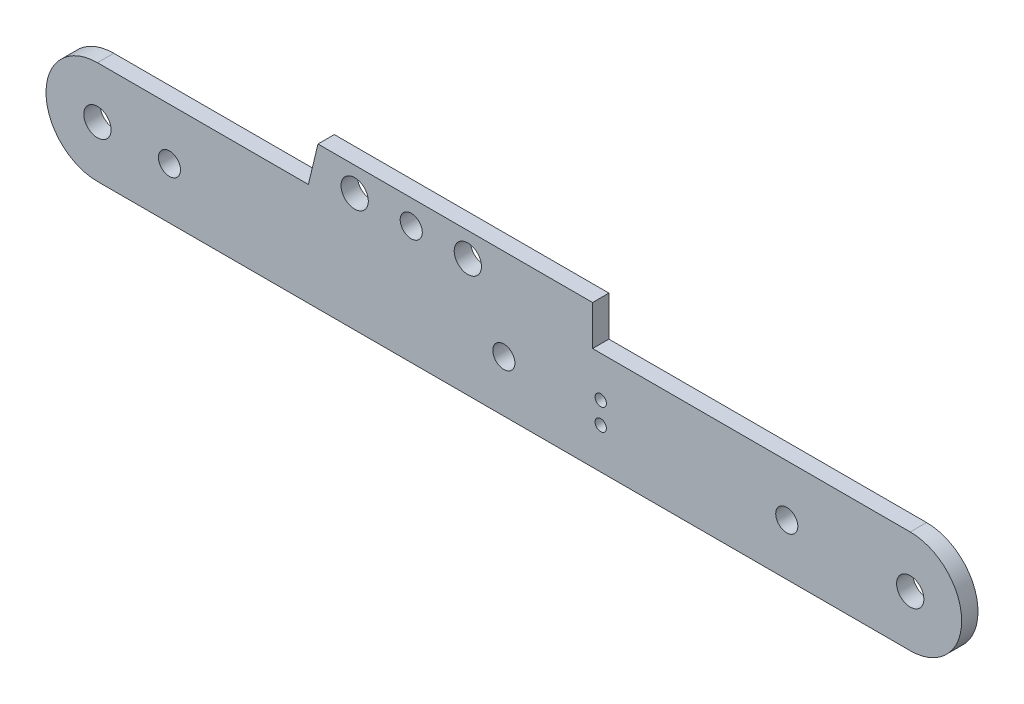
ISO-10303-21;
HEADER;
FILE_DESCRIPTION(('STEP AP214'),'2;1');
FILE_NAME('part.step','',(''),(''),'','','');
FILE_SCHEMA(('AUTOMOTIVE_DESIGN { 1 0 10303 214 1 1 1 1 }'));
ENDSEC;
DATA;
#1=APPLICATION_CONTEXT('core data for automotive mechanical design processes');
#2=APPLICATION_PROTOCOL_DEFINITION('international standard','automotive_design',2000,#1);
#3=PRODUCT_CONTEXT('',#1,'mechanical');
#4=PRODUCT('Part','Part','',(#3));
#5=PRODUCT_RELATED_PRODUCT_CATEGORY('part','',(#4));
#6=PRODUCT_DEFINITION_FORMATION('','',#4);
#7=PRODUCT_DEFINITION_CONTEXT('part definition',#1,'design');
#8=PRODUCT_DEFINITION('design','',#6,#7);
#9=PRODUCT_DEFINITION_SHAPE('','',#8);
#10=(LENGTH_UNIT() NAMED_UNIT(*) SI_UNIT(.MILLI.,.METRE.));
#11=(NAMED_UNIT(*) PLANE_ANGLE_UNIT() SI_UNIT($,.RADIAN.));
#12=(NAMED_UNIT(*) SI_UNIT($,.STERADIAN.) SOLID_ANGLE_UNIT());
#13=UNCERTAINTY_MEASURE_WITH_UNIT(LENGTH_MEASURE(1.E-05),#10,'distance_accuracy_value','');
#14=(GEOMETRIC_REPRESENTATION_CONTEXT(3) GLOBAL_UNCERTAINTY_ASSIGNED_CONTEXT((#13)) GLOBAL_UNIT_ASSIGNED_CONTEXT((#10,
#11,#12)) REPRESENTATION_CONTEXT('',''));
#15=CARTESIAN_POINT('',(0.,0.,0.));
#16=DIRECTION('',(0.,0.,1.));
#17=DIRECTION('',(1.,0.,0.));
#18=AXIS2_PLACEMENT_3D('',#15,#16,#17);
#19=CARTESIAN_POINT('',(-79.,10.,3.175));
#20=DIRECTION('',(0.,-1.,0.));
#21=DIRECTION('',(1.,0.,0.));
#22=AXIS2_PLACEMENT_3D('',#19,#20,#21);
#23=PLANE('',#22);
#24=DIRECTION('',(-1.,0.,0.));
#25=VECTOR('',#24,1.);
#26=CARTESIAN_POINT('',(-79.,10.,0.));
#27=LINE('',#26,#25);
#28=CARTESIAN_POINT('',(79.,10.,0.));
#29=VERTEX_POINT('',#28);
#30=CARTESIAN_POINT('',(17.25,10.,0.));
#31=VERTEX_POINT('',#30);
#32=EDGE_CURVE('E108',#29,#31,#27,.T.);
#33=ORIENTED_EDGE('',*,*,#32,.T.);
#34=DIRECTION('',(0.,0.,-1.));
#35=VECTOR('',#34,1.);
#36=CARTESIAN_POINT('',(17.25,10.,58.9659042765933));
#37=LINE('',#36,#35);
#38=CARTESIAN_POINT('',(17.25,10.,3.175));
#39=VERTEX_POINT('',#38);
#40=EDGE_CURVE('E56',#39,#31,#37,.T.);
#41=ORIENTED_EDGE('',*,*,#40,.F.);
#42=DIRECTION('',(-1.,0.,0.));
#43=VECTOR('',#42,1.);
#44=CARTESIAN_POINT('',(-79.,10.,3.175));
#45=LINE('',#44,#43);
#46=CARTESIAN_POINT('',(79.,10.,3.175));
#47=VERTEX_POINT('',#46);
#48=EDGE_CURVE('E158',#47,#39,#45,.T.);
#49=ORIENTED_EDGE('',*,*,#48,.F.);
#50=DIRECTION('',(0.,0.,-1.));
#51=VECTOR('',#50,1.);
#52=CARTESIAN_POINT('',(79.,10.,3.175));
#53=LINE('',#52,#51);
#54=EDGE_CURVE('E11',#47,#29,#53,.T.);
#55=ORIENTED_EDGE('',*,*,#54,.T.);
#56=EDGE_LOOP('',(#33,#41,#49,#55));
#57=FACE_BOUND('',#56,.T.);
#58=ADVANCED_FACE('F33',(#57),#23,.F.);
#59=CARTESIAN_POINT('',(79.,0.,3.175));
#60=DIRECTION('',(0.,0.,-1.));
#61=DIRECTION('',(-1.,0.,0.));
#62=AXIS2_PLACEMENT_3D('',#59,#60,#61);
#63=CYLINDRICAL_SURFACE('',#62,10.);
#64=CARTESIAN_POINT('',(79.,0.,0.));
#65=DIRECTION('',(0.,0.,1.));
#66=DIRECTION('',(-1.,0.,0.));
#67=AXIS2_PLACEMENT_3D('',#64,#65,#66);
#68=CIRCLE('',#67,10.);
#69=CARTESIAN_POINT('',(79.,-10.,0.));
#70=VERTEX_POINT('',#69);
#71=EDGE_CURVE('E109',#70,#29,#68,.T.);
#72=ORIENTED_EDGE('',*,*,#71,.T.);
#73=ORIENTED_EDGE('',*,*,#54,.F.);
#74=CARTESIAN_POINT('',(79.,0.,3.175));
#75=DIRECTION('',(0.,0.,1.));
#76=DIRECTION('',(-1.,0.,0.));
#77=AXIS2_PLACEMENT_3D('',#74,#75,#76);
#78=CIRCLE('',#77,10.);
#79=CARTESIAN_POINT('',(79.,-10.,3.175));
#80=VERTEX_POINT('',#79);
#81=EDGE_CURVE('E154',#80,#47,#78,.T.);
#82=ORIENTED_EDGE('',*,*,#81,.F.);
#83=DIRECTION('',(0.,0.,-1.));
#84=VECTOR('',#83,1.);
#85=CARTESIAN_POINT('',(79.,-10.,3.175));
#86=LINE('',#85,#84);
#87=EDGE_CURVE('E164',#80,#70,#86,.T.);
#88=ORIENTED_EDGE('',*,*,#87,.T.);
#89=EDGE_LOOP('',(#72,#73,#82,#88));
#90=FACE_BOUND('',#89,.T.);
#91=ADVANCED_FACE('F35',(#90),#63,.T.);
#92=CARTESIAN_POINT('',(-38.,10.,3.175));
#93=VERTEX_POINT('',#92);
#94=CARTESIAN_POINT('',(-79.,10.,3.175));
#95=VERTEX_POINT('',#94);
#96=EDGE_CURVE('E48',#93,#95,#45,.T.);
#97=ORIENTED_EDGE('',*,*,#96,.F.);
#98=DIRECTION('',(0.,0.,-1.));
#99=VECTOR('',#98,1.);
#100=CARTESIAN_POINT('',(-38.,10.,58.9659042765933));
#101=LINE('',#100,#99);
#102=CARTESIAN_POINT('',(-38.,10.,0.));
#103=VERTEX_POINT('',#102);
#104=EDGE_CURVE('E112',#93,#103,#101,.T.);
#105=ORIENTED_EDGE('',*,*,#104,.T.);
#106=CARTESIAN_POINT('',(-79.,10.,0.));
#107=VERTEX_POINT('',#106);
#108=EDGE_CURVE('E99',#103,#107,#27,.T.);
#109=ORIENTED_EDGE('',*,*,#108,.T.);
#110=DIRECTION('',(0.,0.,-1.));
#111=VECTOR('',#110,1.);
#112=CARTESIAN_POINT('',(-79.,10.,3.175));
#113=LINE('',#112,#111);
#114=EDGE_CURVE('E41',#95,#107,#113,.T.);
#115=ORIENTED_EDGE('',*,*,#114,.F.);
#116=EDGE_LOOP('',(#97,#105,#109,#115));
#117=FACE_BOUND('',#116,.T.);
#118=ADVANCED_FACE('F113',(#117),#23,.F.);
#119=CARTESIAN_POINT('',(-79.,0.,3.175));
#120=DIRECTION('',(0.,0.,-1.));
#121=DIRECTION('',(-1.,0.,0.));
#122=AXIS2_PLACEMENT_3D('',#119,#120,#121);
#123=CYLINDRICAL_SURFACE('',#122,10.);
#124=CARTESIAN_POINT('',(-79.,0.,0.));
#125=DIRECTION('',(0.,0.,1.));
#126=DIRECTION('',(-1.,0.,0.));
#127=AXIS2_PLACEMENT_3D('',#124,#125,#126);
#128=CIRCLE('',#127,10.);
#129=CARTESIAN_POINT('',(-79.,-10.,0.));
#130=VERTEX_POINT('',#129);
#131=EDGE_CURVE('E106',#107,#130,#128,.T.);
#132=ORIENTED_EDGE('',*,*,#131,.T.);
#133=DIRECTION('',(0.,0.,-1.));
#134=VECTOR('',#133,1.);
#135=CARTESIAN_POINT('',(-79.,-10.,3.175));
#136=LINE('',#135,#134);
#137=CARTESIAN_POINT('',(-79.,-10.,3.175));
#138=VERTEX_POINT('',#137);
#139=EDGE_CURVE('E171',#138,#130,#136,.T.);
#140=ORIENTED_EDGE('',*,*,#139,.F.);
#141=CARTESIAN_POINT('',(-79.,0.,3.175));
#142=DIRECTION('',(0.,0.,1.));
#143=DIRECTION('',(-1.,0.,0.));
#144=AXIS2_PLACEMENT_3D('',#141,#142,#143);
#145=CIRCLE('',#144,10.);
#146=EDGE_CURVE('E160',#95,#138,#145,.T.);
#147=ORIENTED_EDGE('',*,*,#146,.F.);
#148=ORIENTED_EDGE('',*,*,#114,.T.);
#149=EDGE_LOOP('',(#132,#140,#147,#148));
#150=FACE_BOUND('',#149,.T.);
#151=ADVANCED_FACE('F175',(#150),#123,.T.);
#152=CARTESIAN_POINT('',(-79.,-10.,3.175));
#153=DIRECTION('',(0.,1.,0.));
#154=DIRECTION('',(0.,0.,1.));
#155=AXIS2_PLACEMENT_3D('',#152,#153,#154);
#156=PLANE('',#155);
#157=DIRECTION('',(1.,0.,0.));
#158=VECTOR('',#157,1.);
#159=CARTESIAN_POINT('',(-79.,-10.,0.));
#160=LINE('',#159,#158);
#161=EDGE_CURVE('E157',#130,#70,#160,.T.);
#162=ORIENTED_EDGE('',*,*,#161,.T.);
#163=ORIENTED_EDGE('',*,*,#87,.F.);
#164=DIRECTION('',(1.,0.,0.));
#165=VECTOR('',#164,1.);
#166=CARTESIAN_POINT('',(-79.,-10.,3.175));
#167=LINE('',#166,#165);
#168=EDGE_CURVE('E162',#138,#80,#167,.T.);
#169=ORIENTED_EDGE('',*,*,#168,.F.);
#170=ORIENTED_EDGE('',*,*,#139,.T.);
#171=EDGE_LOOP('',(#162,#163,#169,#170));
#172=FACE_BOUND('',#171,.T.);
#173=ADVANCED_FACE('F211',(#172),#156,.F.);
#174=CARTESIAN_POINT('',(79.,0.,3.175));
#175=DIRECTION('',(0.,0.,-1.));
#176=DIRECTION('',(-1.,0.,0.));
#177=AXIS2_PLACEMENT_3D('',#174,#175,#176);
#178=PLANE('',#177);
#179=CARTESIAN_POINT('',(18.8375,2.1,3.175));
#180=DIRECTION('',(0.,0.,-1.));
#181=DIRECTION('',(-1.,0.,0.));
#182=AXIS2_PLACEMENT_3D('',#179,#180,#181);
#183=CIRCLE('',#182,1.1);
#184=CARTESIAN_POINT('',(17.7375,2.1,3.175));
#185=VERTEX_POINT('',#184);
#186=EDGE_CURVE('E270',#185,#185,#183,.T.);
#187=ORIENTED_EDGE('',*,*,#186,.T.);
#188=EDGE_LOOP('',(#187));
#189=FACE_BOUND('',#188,.T.);
#190=CARTESIAN_POINT('',(18.8375,-2.1,3.175));
#191=DIRECTION('',(0.,0.,-1.));
#192=DIRECTION('',(-1.,0.,0.));
#193=AXIS2_PLACEMENT_3D('',#190,#191,#192);
#194=CIRCLE('',#193,1.1);
#195=CARTESIAN_POINT('',(17.7375,-2.1,3.175));
#196=VERTEX_POINT('',#195);
#197=EDGE_CURVE('E280',#196,#196,#194,.T.);
#198=ORIENTED_EDGE('',*,*,#197,.T.);
#199=EDGE_LOOP('',(#198));
#200=FACE_BOUND('',#199,.T.);
#201=CARTESIAN_POINT('',(55.,0.,3.175));
#202=DIRECTION('',(0.,0.,-1.));
#203=DIRECTION('',(-1.,0.,0.));
#204=AXIS2_PLACEMENT_3D('',#201,#202,#203);
#205=CIRCLE('',#204,2.15);
#206=CARTESIAN_POINT('',(52.85,0.,3.175));
#207=VERTEX_POINT('',#206);
#208=EDGE_CURVE('E286',#207,#207,#205,.T.);
#209=ORIENTED_EDGE('',*,*,#208,.T.);
#210=EDGE_LOOP('',(#209));
#211=FACE_BOUND('',#210,.T.);
#212=CARTESIAN_POINT('',(-18.,13.,3.175));
#213=DIRECTION('',(0.,0.,-1.));
#214=DIRECTION('',(-1.,0.,0.));
#215=AXIS2_PLACEMENT_3D('',#212,#213,#214);
#216=CIRCLE('',#215,2.15);
#217=CARTESIAN_POINT('',(-20.15,13.,3.175));
#218=VERTEX_POINT('',#217);
#219=EDGE_CURVE('E292',#218,#218,#216,.T.);
#220=ORIENTED_EDGE('',*,*,#219,.T.);
#221=EDGE_LOOP('',(#220));
#222=FACE_BOUND('',#221,.T.);
#223=CARTESIAN_POINT('',(-65.,0.,3.175));
#224=DIRECTION('',(0.,0.,-1.));
#225=DIRECTION('',(-1.,0.,0.));
#226=AXIS2_PLACEMENT_3D('',#223,#224,#225);
#227=CIRCLE('',#226,2.15);
#228=CARTESIAN_POINT('',(-67.15,0.,3.175));
#229=VERTEX_POINT('',#228);
#230=EDGE_CURVE('E298',#229,#229,#227,.T.);
#231=ORIENTED_EDGE('',*,*,#230,.T.);
#232=EDGE_LOOP('',(#231));
#233=FACE_BOUND('',#232,.T.);
#234=CARTESIAN_POINT('',(0.,0.,3.175));
#235=DIRECTION('',(0.,0.,-1.));
#236=DIRECTION('',(-1.,0.,0.));
#237=AXIS2_PLACEMENT_3D('',#234,#235,#236);
#238=CIRCLE('',#237,2.15);
#239=CARTESIAN_POINT('',(-2.15,0.,3.175));
#240=VERTEX_POINT('',#239);
#241=EDGE_CURVE('E304',#240,#240,#238,.T.);
#242=ORIENTED_EDGE('',*,*,#241,.T.);
#243=EDGE_LOOP('',(#242));
#244=FACE_BOUND('',#243,.T.);
#245=CARTESIAN_POINT('',(-7.,13.,3.175));
#246=DIRECTION('',(0.,0.,-1.));
#247=DIRECTION('',(-1.,0.,0.));
#248=AXIS2_PLACEMENT_3D('',#245,#246,#247);
#249=CIRCLE('',#248,2.65);
#250=CARTESIAN_POINT('',(-9.65,13.,3.175));
#251=VERTEX_POINT('',#250);
#252=EDGE_CURVE('E310',#251,#251,#249,.T.);
#253=ORIENTED_EDGE('',*,*,#252,.T.);
#254=EDGE_LOOP('',(#253));
#255=FACE_BOUND('',#254,.T.);
#256=CARTESIAN_POINT('',(-29.,13.,3.175));
#257=DIRECTION('',(0.,0.,-1.));
#258=DIRECTION('',(-1.,0.,0.));
#259=AXIS2_PLACEMENT_3D('',#256,#257,#258);
#260=CIRCLE('',#259,2.65);
#261=CARTESIAN_POINT('',(-31.65,13.,3.175));
#262=VERTEX_POINT('',#261);
#263=EDGE_CURVE('E123',#262,#262,#260,.T.);
#264=ORIENTED_EDGE('',*,*,#263,.T.);
#265=EDGE_LOOP('',(#264));
#266=FACE_BOUND('',#265,.T.);
#267=CARTESIAN_POINT('',(79.,0.,3.175));
#268=DIRECTION('',(0.,0.,-1.));
#269=DIRECTION('',(-1.,0.,0.));
#270=AXIS2_PLACEMENT_3D('',#267,#268,#269);
#271=CIRCLE('',#270,2.65);
#272=CARTESIAN_POINT('',(76.35,0.,3.175));
#273=VERTEX_POINT('',#272);
#274=EDGE_CURVE('E145',#273,#273,#271,.T.);
#275=ORIENTED_EDGE('',*,*,#274,.T.);
#276=EDGE_LOOP('',(#275));
#277=FACE_BOUND('',#276,.T.);
#278=CARTESIAN_POINT('',(-79.,0.,3.175));
#279=DIRECTION('',(0.,0.,-1.));
#280=DIRECTION('',(-1.,0.,0.));
#281=AXIS2_PLACEMENT_3D('',#278,#279,#280);
#282=CIRCLE('',#281,2.65);
#283=CARTESIAN_POINT('',(-81.65,0.,3.175));
#284=VERTEX_POINT('',#283);
#285=EDGE_CURVE('E151',#284,#284,#282,.T.);
#286=ORIENTED_EDGE('',*,*,#285,.T.);
#287=EDGE_LOOP('',(#286));
#288=FACE_BOUND('',#287,.T.);
#289=ORIENTED_EDGE('',*,*,#81,.T.);
#290=ORIENTED_EDGE('',*,*,#48,.T.);
#291=DIRECTION('',(0.,1.,0.));
#292=VECTOR('',#291,1.);
#293=CARTESIAN_POINT('',(17.25,17.75,3.175));
#294=LINE('',#293,#292);
#295=CARTESIAN_POINT('',(17.25,17.75,3.175));
#296=VERTEX_POINT('',#295);
#297=EDGE_CURVE('E130',#39,#296,#294,.T.);
#298=ORIENTED_EDGE('',*,*,#297,.T.);
#299=DIRECTION('',(-1.,0.,0.));
#300=VECTOR('',#299,1.);
#301=CARTESIAN_POINT('',(-36.1293103448276,17.75,3.175));
#302=LINE('',#301,#300);
#303=CARTESIAN_POINT('',(-36.1293103448276,17.75,3.175));
#304=VERTEX_POINT('',#303);
#305=EDGE_CURVE('E136',#296,#304,#302,.T.);
#306=ORIENTED_EDGE('',*,*,#305,.T.);
#307=DIRECTION('',(-0.234640533103897,-0.972082208573287,0.));
#308=VECTOR('',#307,1.);
#309=CARTESIAN_POINT('',(-38.,10.,3.175));
#310=LINE('',#309,#308);
#311=EDGE_CURVE('E140',#304,#93,#310,.T.);
#312=ORIENTED_EDGE('',*,*,#311,.T.);
#313=ORIENTED_EDGE('',*,*,#96,.T.);
#314=ORIENTED_EDGE('',*,*,#146,.T.);
#315=ORIENTED_EDGE('',*,*,#168,.T.);
#316=EDGE_LOOP('',(#289,#290,#298,#306,#312,#313,#314,#315));
#317=FACE_BOUND('',#316,.T.);
#318=ADVANCED_FACE('F179',(#189,#200,#211,#222,#233,#244,#255,#266,#277,#288,#317),#178,.F.);
#319=CARTESIAN_POINT('',(79.,0.,0.));
#320=DIRECTION('',(0.,0.,-1.));
#321=DIRECTION('',(-1.,0.,0.));
#322=AXIS2_PLACEMENT_3D('',#319,#320,#321);
#323=PLANE('',#322);
#324=CARTESIAN_POINT('',(18.8375,2.1,0.));
#325=DIRECTION('',(0.,0.,-1.));
#326=DIRECTION('',(-1.,0.,0.));
#327=AXIS2_PLACEMENT_3D('',#324,#325,#326);
#328=CIRCLE('',#327,1.1);
#329=CARTESIAN_POINT('',(17.7375,2.1,0.));
#330=VERTEX_POINT('',#329);
#331=EDGE_CURVE('E273',#330,#330,#328,.T.);
#332=ORIENTED_EDGE('',*,*,#331,.F.);
#333=EDGE_LOOP('',(#332));
#334=FACE_BOUND('',#333,.T.);
#335=CARTESIAN_POINT('',(18.8375,-2.1,0.));
#336=DIRECTION('',(0.,0.,-1.));
#337=DIRECTION('',(-1.,0.,0.));
#338=AXIS2_PLACEMENT_3D('',#335,#336,#337);
#339=CIRCLE('',#338,1.1);
#340=CARTESIAN_POINT('',(17.7375,-2.1,0.));
#341=VERTEX_POINT('',#340);
#342=EDGE_CURVE('E275',#341,#341,#339,.T.);
#343=ORIENTED_EDGE('',*,*,#342,.F.);
#344=EDGE_LOOP('',(#343));
#345=FACE_BOUND('',#344,.T.);
#346=CARTESIAN_POINT('',(55.,0.,0.));
#347=DIRECTION('',(0.,0.,-1.));
#348=DIRECTION('',(-1.,0.,0.));
#349=AXIS2_PLACEMENT_3D('',#346,#347,#348);
#350=CIRCLE('',#349,2.15);
#351=CARTESIAN_POINT('',(52.85,0.,0.));
#352=VERTEX_POINT('',#351);
#353=EDGE_CURVE('E283',#352,#352,#350,.T.);
#354=ORIENTED_EDGE('',*,*,#353,.F.);
#355=EDGE_LOOP('',(#354));
#356=FACE_BOUND('',#355,.T.);
#357=CARTESIAN_POINT('',(-18.,13.,0.));
#358=DIRECTION('',(0.,0.,-1.));
#359=DIRECTION('',(-1.,0.,0.));
#360=AXIS2_PLACEMENT_3D('',#357,#358,#359);
#361=CIRCLE('',#360,2.15);
#362=CARTESIAN_POINT('',(-20.15,13.,0.));
#363=VERTEX_POINT('',#362);
#364=EDGE_CURVE('E289',#363,#363,#361,.T.);
#365=ORIENTED_EDGE('',*,*,#364,.F.);
#366=EDGE_LOOP('',(#365));
#367=FACE_BOUND('',#366,.T.);
#368=CARTESIAN_POINT('',(-65.,0.,0.));
#369=DIRECTION('',(0.,0.,-1.));
#370=DIRECTION('',(-1.,0.,0.));
#371=AXIS2_PLACEMENT_3D('',#368,#369,#370);
#372=CIRCLE('',#371,2.15);
#373=CARTESIAN_POINT('',(-67.15,0.,0.));
#374=VERTEX_POINT('',#373);
#375=EDGE_CURVE('E295',#374,#374,#372,.T.);
#376=ORIENTED_EDGE('',*,*,#375,.F.);
#377=EDGE_LOOP('',(#376));
#378=FACE_BOUND('',#377,.T.);
#379=CARTESIAN_POINT('',(0.,0.,0.));
#380=DIRECTION('',(0.,0.,-1.));
#381=DIRECTION('',(-1.,0.,0.));
#382=AXIS2_PLACEMENT_3D('',#379,#380,#381);
#383=CIRCLE('',#382,2.15);
#384=CARTESIAN_POINT('',(-2.15,0.,0.));
#385=VERTEX_POINT('',#384);
#386=EDGE_CURVE('E301',#385,#385,#383,.T.);
#387=ORIENTED_EDGE('',*,*,#386,.F.);
#388=EDGE_LOOP('',(#387));
#389=FACE_BOUND('',#388,.T.);
#390=CARTESIAN_POINT('',(-7.,13.,0.));
#391=DIRECTION('',(0.,0.,-1.));
#392=DIRECTION('',(-1.,0.,0.));
#393=AXIS2_PLACEMENT_3D('',#390,#391,#392);
#394=CIRCLE('',#393,2.65);
#395=CARTESIAN_POINT('',(-9.65,13.,0.));
#396=VERTEX_POINT('',#395);
#397=EDGE_CURVE('E307',#396,#396,#394,.T.);
#398=ORIENTED_EDGE('',*,*,#397,.F.);
#399=EDGE_LOOP('',(#398));
#400=FACE_BOUND('',#399,.T.);
#401=CARTESIAN_POINT('',(-29.,13.,0.));
#402=DIRECTION('',(0.,0.,-1.));
#403=DIRECTION('',(-1.,0.,0.));
#404=AXIS2_PLACEMENT_3D('',#401,#402,#403);
#405=CIRCLE('',#404,2.65);
#406=CARTESIAN_POINT('',(-31.65,13.,0.));
#407=VERTEX_POINT('',#406);
#408=EDGE_CURVE('E127',#407,#407,#405,.T.);
#409=ORIENTED_EDGE('',*,*,#408,.F.);
#410=EDGE_LOOP('',(#409));
#411=FACE_BOUND('',#410,.T.);
#412=CARTESIAN_POINT('',(79.,0.,0.));
#413=DIRECTION('',(0.,0.,-1.));
#414=DIRECTION('',(-1.,0.,0.));
#415=AXIS2_PLACEMENT_3D('',#412,#413,#414);
#416=CIRCLE('',#415,2.65);
#417=CARTESIAN_POINT('',(76.35,0.,0.));
#418=VERTEX_POINT('',#417);
#419=EDGE_CURVE('E142',#418,#418,#416,.T.);
#420=ORIENTED_EDGE('',*,*,#419,.F.);
#421=EDGE_LOOP('',(#420));
#422=FACE_BOUND('',#421,.T.);
#423=CARTESIAN_POINT('',(-79.,0.,0.));
#424=DIRECTION('',(0.,0.,-1.));
#425=DIRECTION('',(-1.,0.,0.));
#426=AXIS2_PLACEMENT_3D('',#423,#424,#425);
#427=CIRCLE('',#426,2.65);
#428=CARTESIAN_POINT('',(-81.65,0.,0.));
#429=VERTEX_POINT('',#428);
#430=EDGE_CURVE('E148',#429,#429,#427,.T.);
#431=ORIENTED_EDGE('',*,*,#430,.F.);
#432=EDGE_LOOP('',(#431));
#433=FACE_BOUND('',#432,.T.);
#434=ORIENTED_EDGE('',*,*,#71,.F.);
#435=ORIENTED_EDGE('',*,*,#161,.F.);
#436=ORIENTED_EDGE('',*,*,#131,.F.);
#437=ORIENTED_EDGE('',*,*,#108,.F.);
#438=DIRECTION('',(0.234640533103897,0.972082208573287,0.));
#439=VECTOR('',#438,1.);
#440=CARTESIAN_POINT('',(-38.,10.,0.));
#441=LINE('',#440,#439);
#442=CARTESIAN_POINT('',(-36.1293103448276,17.75,0.));
#443=VERTEX_POINT('',#442);
#444=EDGE_CURVE('E104',#103,#443,#441,.T.);
#445=ORIENTED_EDGE('',*,*,#444,.T.);
#446=DIRECTION('',(1.,0.,0.));
#447=VECTOR('',#446,1.);
#448=CARTESIAN_POINT('',(-36.1293103448276,17.75,0.));
#449=LINE('',#448,#447);
#450=CARTESIAN_POINT('',(17.25,17.75,0.));
#451=VERTEX_POINT('',#450);
#452=EDGE_CURVE('E122',#443,#451,#449,.T.);
#453=ORIENTED_EDGE('',*,*,#452,.T.);
#454=DIRECTION('',(0.,-1.,0.));
#455=VECTOR('',#454,1.);
#456=CARTESIAN_POINT('',(17.25,17.75,0.));
#457=LINE('',#456,#455);
#458=EDGE_CURVE('E117',#451,#31,#457,.T.);
#459=ORIENTED_EDGE('',*,*,#458,.T.);
#460=ORIENTED_EDGE('',*,*,#32,.F.);
#461=EDGE_LOOP('',(#434,#435,#436,#437,#445,#453,#459,#460));
#462=FACE_BOUND('',#461,.T.);
#463=ADVANCED_FACE('F101',(#334,#345,#356,#367,#378,#389,#400,#411,#422,#433,#462),#323,.T.);
#464=CARTESIAN_POINT('',(-79.,0.,0.));
#465=DIRECTION('',(0.,0.,-1.));
#466=DIRECTION('',(-1.,0.,0.));
#467=AXIS2_PLACEMENT_3D('',#464,#465,#466);
#468=CYLINDRICAL_SURFACE('',#467,2.65);
#469=ORIENTED_EDGE('',*,*,#285,.F.);
#470=EDGE_LOOP('',(#469));
#471=FACE_BOUND('',#470,.T.);
#472=ORIENTED_EDGE('',*,*,#430,.T.);
#473=EDGE_LOOP('',(#472));
#474=FACE_BOUND('',#473,.T.);
#475=ADVANCED_FACE('F197',(#471,#474),#468,.F.);
#476=CARTESIAN_POINT('',(79.,0.,0.));
#477=DIRECTION('',(0.,0.,-1.));
#478=DIRECTION('',(-1.,0.,0.));
#479=AXIS2_PLACEMENT_3D('',#476,#477,#478);
#480=CYLINDRICAL_SURFACE('',#479,2.65);
#481=ORIENTED_EDGE('',*,*,#274,.F.);
#482=EDGE_LOOP('',(#481));
#483=FACE_BOUND('',#482,.T.);
#484=ORIENTED_EDGE('',*,*,#419,.T.);
#485=EDGE_LOOP('',(#484));
#486=FACE_BOUND('',#485,.T.);
#487=ADVANCED_FACE('F190',(#483,#486),#480,.F.);
#488=CARTESIAN_POINT('',(17.25,17.75,58.9659042765933));
#489=DIRECTION('',(1.,0.,0.));
#490=DIRECTION('',(0.,1.,0.));
#491=AXIS2_PLACEMENT_3D('',#488,#489,#490);
#492=PLANE('',#491);
#493=ORIENTED_EDGE('',*,*,#297,.F.);
#494=ORIENTED_EDGE('',*,*,#40,.T.);
#495=ORIENTED_EDGE('',*,*,#458,.F.);
#496=DIRECTION('',(0.,0.,-1.));
#497=VECTOR('',#496,1.);
#498=CARTESIAN_POINT('',(17.25,17.75,58.9659042765933));
#499=LINE('',#498,#497);
#500=EDGE_CURVE('E137',#296,#451,#499,.T.);
#501=ORIENTED_EDGE('',*,*,#500,.F.);
#502=EDGE_LOOP('',(#493,#494,#495,#501));
#503=FACE_BOUND('',#502,.T.);
#504=ADVANCED_FACE('F188',(#503),#492,.T.);
#505=CARTESIAN_POINT('',(-36.1293103448276,17.75,58.9659042765933));
#506=DIRECTION('',(0.,1.,0.));
#507=DIRECTION('',(-1.,0.,0.));
#508=AXIS2_PLACEMENT_3D('',#505,#506,#507);
#509=PLANE('',#508);
#510=ORIENTED_EDGE('',*,*,#305,.F.);
#511=ORIENTED_EDGE('',*,*,#500,.T.);
#512=ORIENTED_EDGE('',*,*,#452,.F.);
#513=DIRECTION('',(0.,0.,-1.));
#514=VECTOR('',#513,1.);
#515=CARTESIAN_POINT('',(-36.1293103448276,17.75,58.9659042765933));
#516=LINE('',#515,#514);
#517=EDGE_CURVE('E116',#304,#443,#516,.T.);
#518=ORIENTED_EDGE('',*,*,#517,.F.);
#519=EDGE_LOOP('',(#510,#511,#512,#518));
#520=FACE_BOUND('',#519,.T.);
#521=ADVANCED_FACE('F185',(#520),#509,.T.);
#522=CARTESIAN_POINT('',(-38.,10.,58.9659042765933));
#523=DIRECTION('',(-0.972082208573287,0.234640533103897,0.));
#524=DIRECTION('',(-0.234640533103897,-0.972082208573287,0.));
#525=AXIS2_PLACEMENT_3D('',#522,#523,#524);
#526=PLANE('',#525);
#527=ORIENTED_EDGE('',*,*,#311,.F.);
#528=ORIENTED_EDGE('',*,*,#517,.T.);
#529=ORIENTED_EDGE('',*,*,#444,.F.);
#530=ORIENTED_EDGE('',*,*,#104,.F.);
#531=EDGE_LOOP('',(#527,#528,#529,#530));
#532=FACE_BOUND('',#531,.T.);
#533=ADVANCED_FACE('F119',(#532),#526,.T.);
#534=CARTESIAN_POINT('',(-29.,13.,0.));
#535=DIRECTION('',(0.,0.,-1.));
#536=DIRECTION('',(-1.,0.,0.));
#537=AXIS2_PLACEMENT_3D('',#534,#535,#536);
#538=CYLINDRICAL_SURFACE('',#537,2.65);
#539=ORIENTED_EDGE('',*,*,#263,.F.);
#540=EDGE_LOOP('',(#539));
#541=FACE_BOUND('',#540,.T.);
#542=ORIENTED_EDGE('',*,*,#408,.T.);
#543=EDGE_LOOP('',(#542));
#544=FACE_BOUND('',#543,.T.);
#545=ADVANCED_FACE('F228',(#541,#544),#538,.F.);
#546=CARTESIAN_POINT('',(-7.,13.,0.));
#547=DIRECTION('',(0.,0.,-1.));
#548=DIRECTION('',(-1.,0.,0.));
#549=AXIS2_PLACEMENT_3D('',#546,#547,#548);
#550=CYLINDRICAL_SURFACE('',#549,2.65);
#551=ORIENTED_EDGE('',*,*,#252,.F.);
#552=EDGE_LOOP('',(#551));
#553=FACE_BOUND('',#552,.T.);
#554=ORIENTED_EDGE('',*,*,#397,.T.);
#555=EDGE_LOOP('',(#554));
#556=FACE_BOUND('',#555,.T.);
#557=ADVANCED_FACE('F232',(#553,#556),#550,.F.);
#558=CARTESIAN_POINT('',(0.,0.,0.));
#559=DIRECTION('',(0.,0.,-1.));
#560=DIRECTION('',(-1.,0.,0.));
#561=AXIS2_PLACEMENT_3D('',#558,#559,#560);
#562=CYLINDRICAL_SURFACE('',#561,2.15);
#563=ORIENTED_EDGE('',*,*,#241,.F.);
#564=EDGE_LOOP('',(#563));
#565=FACE_BOUND('',#564,.T.);
#566=ORIENTED_EDGE('',*,*,#386,.T.);
#567=EDGE_LOOP('',(#566));
#568=FACE_BOUND('',#567,.T.);
#569=ADVANCED_FACE('F237',(#565,#568),#562,.F.);
#570=CARTESIAN_POINT('',(-65.,0.,0.));
#571=DIRECTION('',(0.,0.,-1.));
#572=DIRECTION('',(-1.,0.,0.));
#573=AXIS2_PLACEMENT_3D('',#570,#571,#572);
#574=CYLINDRICAL_SURFACE('',#573,2.15);
#575=ORIENTED_EDGE('',*,*,#230,.F.);
#576=EDGE_LOOP('',(#575));
#577=FACE_BOUND('',#576,.T.);
#578=ORIENTED_EDGE('',*,*,#375,.T.);
#579=EDGE_LOOP('',(#578));
#580=FACE_BOUND('',#579,.T.);
#581=ADVANCED_FACE('F245',(#577,#580),#574,.F.);
#582=CARTESIAN_POINT('',(-18.,13.,0.));
#583=DIRECTION('',(0.,0.,-1.));
#584=DIRECTION('',(-1.,0.,0.));
#585=AXIS2_PLACEMENT_3D('',#582,#583,#584);
#586=CYLINDRICAL_SURFACE('',#585,2.15);
#587=ORIENTED_EDGE('',*,*,#219,.F.);
#588=EDGE_LOOP('',(#587));
#589=FACE_BOUND('',#588,.T.);
#590=ORIENTED_EDGE('',*,*,#364,.T.);
#591=EDGE_LOOP('',(#590));
#592=FACE_BOUND('',#591,.T.);
#593=ADVANCED_FACE('F249',(#589,#592),#586,.F.);
#594=CARTESIAN_POINT('',(55.,0.,0.));
#595=DIRECTION('',(0.,0.,-1.));
#596=DIRECTION('',(-1.,0.,0.));
#597=AXIS2_PLACEMENT_3D('',#594,#595,#596);
#598=CYLINDRICAL_SURFACE('',#597,2.15);
#599=ORIENTED_EDGE('',*,*,#208,.F.);
#600=EDGE_LOOP('',(#599));
#601=FACE_BOUND('',#600,.T.);
#602=ORIENTED_EDGE('',*,*,#353,.T.);
#603=EDGE_LOOP('',(#602));
#604=FACE_BOUND('',#603,.T.);
#605=ADVANCED_FACE('F253',(#601,#604),#598,.F.);
#606=CARTESIAN_POINT('',(18.8375,-2.1,0.));
#607=DIRECTION('',(0.,0.,-1.));
#608=DIRECTION('',(-1.,0.,0.));
#609=AXIS2_PLACEMENT_3D('',#606,#607,#608);
#610=CYLINDRICAL_SURFACE('',#609,1.1);
#611=ORIENTED_EDGE('',*,*,#197,.F.);
#612=EDGE_LOOP('',(#611));
#613=FACE_BOUND('',#612,.T.);
#614=ORIENTED_EDGE('',*,*,#342,.T.);
#615=EDGE_LOOP('',(#614));
#616=FACE_BOUND('',#615,.T.);
#617=ADVANCED_FACE('F257',(#613,#616),#610,.F.);
#618=CARTESIAN_POINT('',(18.8375,2.1,0.));
#619=DIRECTION('',(0.,0.,-1.));
#620=DIRECTION('',(-1.,0.,0.));
#621=AXIS2_PLACEMENT_3D('',#618,#619,#620);
#622=CYLINDRICAL_SURFACE('',#621,1.1);
#623=ORIENTED_EDGE('',*,*,#186,.F.);
#624=EDGE_LOOP('',(#623));
#625=FACE_BOUND('',#624,.T.);
#626=ORIENTED_EDGE('',*,*,#331,.T.);
#627=EDGE_LOOP('',(#626));
#628=FACE_BOUND('',#627,.T.);
#629=ADVANCED_FACE('F261',(#625,#628),#622,.F.);
#630=CLOSED_SHELL('',(#58,#91,#118,#151,#173,#318,#463,#475,#487,#504,#521,#533,#545,#557,#569,
#581,#593,#605,#617,#629));
#631=MANIFOLD_SOLID_BREP('B2',#630);
#632=ADVANCED_BREP_SHAPE_REPRESENTATION('',(#18,#631),#14);
#633=SHAPE_DEFINITION_REPRESENTATION(#9,#632);
ENDSEC;
END-ISO-10303-21;
